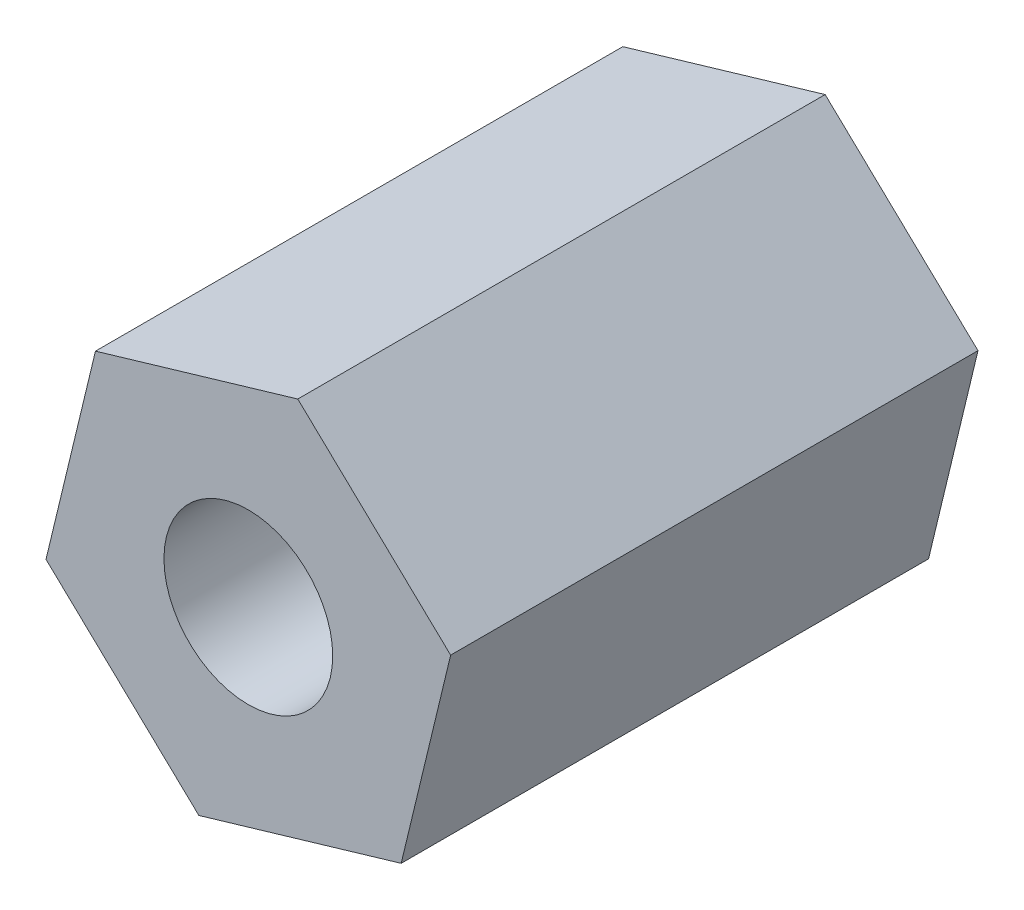
ISO-10303-21;
HEADER;
FILE_DESCRIPTION(('STEP AP214'),'2;1');
FILE_NAME('part.step','',(''),(''),'','','');
FILE_SCHEMA(('AUTOMOTIVE_DESIGN { 1 0 10303 214 1 1 1 1 }'));
ENDSEC;
DATA;
#1=APPLICATION_CONTEXT('core data for automotive mechanical design processes');
#2=APPLICATION_PROTOCOL_DEFINITION('international standard','automotive_design',2000,#1);
#3=PRODUCT_CONTEXT('',#1,'mechanical');
#4=PRODUCT('Part','Part','',(#3));
#5=PRODUCT_RELATED_PRODUCT_CATEGORY('part','',(#4));
#6=PRODUCT_DEFINITION_FORMATION('','',#4);
#7=PRODUCT_DEFINITION_CONTEXT('part definition',#1,'design');
#8=PRODUCT_DEFINITION('design','',#6,#7);
#9=PRODUCT_DEFINITION_SHAPE('','',#8);
#10=(LENGTH_UNIT() NAMED_UNIT(*) SI_UNIT(.MILLI.,.METRE.));
#11=(NAMED_UNIT(*) PLANE_ANGLE_UNIT() SI_UNIT($,.RADIAN.));
#12=(NAMED_UNIT(*) SI_UNIT($,.STERADIAN.) SOLID_ANGLE_UNIT());
#13=UNCERTAINTY_MEASURE_WITH_UNIT(LENGTH_MEASURE(1.E-05),#10,'distance_accuracy_value','');
#14=(GEOMETRIC_REPRESENTATION_CONTEXT(3) GLOBAL_UNCERTAINTY_ASSIGNED_CONTEXT((#13)) GLOBAL_UNIT_ASSIGNED_CONTEXT((#10,
#11,#12)) REPRESENTATION_CONTEXT('',''));
#15=CARTESIAN_POINT('',(0.,0.,0.));
#16=DIRECTION('',(0.,0.,1.));
#17=DIRECTION('',(1.,0.,0.));
#18=AXIS2_PLACEMENT_3D('',#15,#16,#17);
#19=CARTESIAN_POINT('',(-0.938021007151593,-3.88845941089042,10.));
#20=DIRECTION('',(-0.282969920992117,0.959128783747894,0.));
#21=DIRECTION('',(-0.959128783747894,-0.282969920992117,0.));
#22=AXIS2_PLACEMENT_3D('',#19,#20,#21);
#23=PLANE('',#22);
#24=DIRECTION('',(0.959128783747894,0.282969920992117,0.));
#25=VECTOR('',#24,1.);
#26=CARTESIAN_POINT('',(-0.938021007151593,-3.88845941089042,0.));
#27=LINE('',#26,#25);
#28=CARTESIAN_POINT('',(-0.938021007151593,-3.88845941089042,0.));
#29=VERTEX_POINT('',#28);
#30=CARTESIAN_POINT('',(2.89849412783998,-2.75657972692196,0.));
#31=VERTEX_POINT('',#30);
#32=EDGE_CURVE('E118',#29,#31,#27,.T.);
#33=ORIENTED_EDGE('',*,*,#32,.T.);
#34=DIRECTION('',(0.,0.,-1.));
#35=VECTOR('',#34,1.);
#36=CARTESIAN_POINT('',(2.89849412783998,-2.75657972692196,10.));
#37=LINE('',#36,#35);
#38=CARTESIAN_POINT('',(2.89849412783998,-2.75657972692196,10.));
#39=VERTEX_POINT('',#38);
#40=EDGE_CURVE('E11',#39,#31,#37,.T.);
#41=ORIENTED_EDGE('',*,*,#40,.F.);
#42=DIRECTION('',(0.959128783747894,0.282969920992117,0.));
#43=VECTOR('',#42,1.);
#44=CARTESIAN_POINT('',(-0.938021007151593,-3.88845941089042,10.));
#45=LINE('',#44,#43);
#46=CARTESIAN_POINT('',(-0.938021007151593,-3.88845941089042,10.));
#47=VERTEX_POINT('',#46);
#48=EDGE_CURVE('E129',#47,#39,#45,.T.);
#49=ORIENTED_EDGE('',*,*,#48,.F.);
#50=DIRECTION('',(0.,0.,-1.));
#51=VECTOR('',#50,1.);
#52=CARTESIAN_POINT('',(-0.938021007151593,-3.88845941089042,10.));
#53=LINE('',#52,#51);
#54=EDGE_CURVE('E114',#47,#29,#53,.T.);
#55=ORIENTED_EDGE('',*,*,#54,.T.);
#56=EDGE_LOOP('',(#33,#41,#49,#55));
#57=FACE_BOUND('',#56,.T.);
#58=ADVANCED_FACE('F34',(#57),#23,.F.);
#59=CARTESIAN_POINT('',(2.89849412783998,-2.75657972692196,10.));
#60=DIRECTION('',(-0.972114852722606,0.234505251787899,0.));
#61=DIRECTION('',(-0.234505251787899,-0.972114852722606,0.));
#62=AXIS2_PLACEMENT_3D('',#59,#60,#61);
#63=PLANE('',#62);
#64=DIRECTION('',(0.234505251787899,0.972114852722606,0.));
#65=VECTOR('',#64,1.);
#66=CARTESIAN_POINT('',(2.89849412783998,-2.75657972692196,0.));
#67=LINE('',#66,#65);
#68=CARTESIAN_POINT('',(3.83651513499158,1.13187968396847,0.));
#69=VERTEX_POINT('',#68);
#70=EDGE_CURVE('E121',#31,#69,#67,.T.);
#71=ORIENTED_EDGE('',*,*,#70,.T.);
#72=DIRECTION('',(0.,0.,-1.));
#73=VECTOR('',#72,1.);
#74=CARTESIAN_POINT('',(3.83651513499158,1.13187968396847,10.));
#75=LINE('',#74,#73);
#76=CARTESIAN_POINT('',(3.83651513499158,1.13187968396847,10.));
#77=VERTEX_POINT('',#76);
#78=EDGE_CURVE('E42',#77,#69,#75,.T.);
#79=ORIENTED_EDGE('',*,*,#78,.F.);
#80=DIRECTION('',(0.234505251787899,0.972114852722606,0.));
#81=VECTOR('',#80,1.);
#82=CARTESIAN_POINT('',(2.89849412783998,-2.75657972692196,10.));
#83=LINE('',#82,#81);
#84=EDGE_CURVE('E87',#39,#77,#83,.T.);
#85=ORIENTED_EDGE('',*,*,#84,.F.);
#86=ORIENTED_EDGE('',*,*,#40,.T.);
#87=EDGE_LOOP('',(#71,#79,#85,#86));
#88=FACE_BOUND('',#87,.T.);
#89=ADVANCED_FACE('F154',(#88),#63,.F.);
#90=CARTESIAN_POINT('',(3.83651513499158,1.13187968396847,10.));
#91=DIRECTION('',(-0.68914493173049,-0.724623531959996,0.));
#92=DIRECTION('',(0.724623531959996,-0.68914493173049,0.));
#93=AXIS2_PLACEMENT_3D('',#90,#91,#92);
#94=PLANE('',#93);
#95=DIRECTION('',(-0.724623531959996,0.68914493173049,0.));
#96=VECTOR('',#95,1.);
#97=CARTESIAN_POINT('',(3.83651513499158,1.13187968396847,0.));
#98=LINE('',#97,#96);
#99=CARTESIAN_POINT('',(0.938021007151594,3.88845941089042,0.));
#100=VERTEX_POINT('',#99);
#101=EDGE_CURVE('E124',#69,#100,#98,.T.);
#102=ORIENTED_EDGE('',*,*,#101,.T.);
#103=DIRECTION('',(0.,0.,-1.));
#104=VECTOR('',#103,1.);
#105=CARTESIAN_POINT('',(0.938021007151594,3.88845941089042,10.));
#106=LINE('',#105,#104);
#107=CARTESIAN_POINT('',(0.938021007151594,3.88845941089042,10.));
#108=VERTEX_POINT('',#107);
#109=EDGE_CURVE('E109',#108,#100,#106,.T.);
#110=ORIENTED_EDGE('',*,*,#109,.F.);
#111=DIRECTION('',(-0.724623531959996,0.68914493173049,0.));
#112=VECTOR('',#111,1.);
#113=CARTESIAN_POINT('',(3.83651513499158,1.13187968396847,10.));
#114=LINE('',#113,#112);
#115=EDGE_CURVE('E100',#77,#108,#114,.T.);
#116=ORIENTED_EDGE('',*,*,#115,.F.);
#117=ORIENTED_EDGE('',*,*,#78,.T.);
#118=EDGE_LOOP('',(#102,#110,#116,#117));
#119=FACE_BOUND('',#118,.T.);
#120=ADVANCED_FACE('F135',(#119),#94,.F.);
#121=CARTESIAN_POINT('',(0.938021007151594,3.88845941089042,10.));
#122=DIRECTION('',(0.282969920992117,-0.959128783747894,0.));
#123=DIRECTION('',(0.959128783747894,0.282969920992117,0.));
#124=AXIS2_PLACEMENT_3D('',#121,#122,#123);
#125=PLANE('',#124);
#126=DIRECTION('',(-0.959128783747895,-0.282969920992117,0.));
#127=VECTOR('',#126,1.);
#128=CARTESIAN_POINT('',(0.938021007151594,3.88845941089042,0.));
#129=LINE('',#128,#127);
#130=CARTESIAN_POINT('',(-2.89849412783998,2.75657972692196,0.));
#131=VERTEX_POINT('',#130);
#132=EDGE_CURVE('E108',#100,#131,#129,.T.);
#133=ORIENTED_EDGE('',*,*,#132,.T.);
#134=DIRECTION('',(0.,0.,-1.));
#135=VECTOR('',#134,1.);
#136=CARTESIAN_POINT('',(-2.89849412783998,2.75657972692196,10.));
#137=LINE('',#136,#135);
#138=CARTESIAN_POINT('',(-2.89849412783998,2.75657972692196,10.));
#139=VERTEX_POINT('',#138);
#140=EDGE_CURVE('E105',#139,#131,#137,.T.);
#141=ORIENTED_EDGE('',*,*,#140,.F.);
#142=DIRECTION('',(-0.959128783747895,-0.282969920992117,0.));
#143=VECTOR('',#142,1.);
#144=CARTESIAN_POINT('',(0.938021007151594,3.88845941089042,10.));
#145=LINE('',#144,#143);
#146=EDGE_CURVE('E94',#108,#139,#145,.T.);
#147=ORIENTED_EDGE('',*,*,#146,.F.);
#148=ORIENTED_EDGE('',*,*,#109,.T.);
#149=EDGE_LOOP('',(#133,#141,#147,#148));
#150=FACE_BOUND('',#149,.T.);
#151=ADVANCED_FACE('F106',(#150),#125,.F.);
#152=CARTESIAN_POINT('',(-2.89849412783998,2.75657972692196,10.));
#153=DIRECTION('',(0.972114852722606,-0.234505251787898,0.));
#154=DIRECTION('',(0.234505251787898,0.972114852722606,0.));
#155=AXIS2_PLACEMENT_3D('',#152,#153,#154);
#156=PLANE('',#155);
#157=DIRECTION('',(-0.234505251787898,-0.972114852722606,0.));
#158=VECTOR('',#157,1.);
#159=CARTESIAN_POINT('',(-2.89849412783998,2.75657972692196,0.));
#160=LINE('',#159,#158);
#161=CARTESIAN_POINT('',(-3.83651513499157,-1.13187968396847,0.));
#162=VERTEX_POINT('',#161);
#163=EDGE_CURVE('E73',#131,#162,#160,.T.);
#164=ORIENTED_EDGE('',*,*,#163,.T.);
#165=DIRECTION('',(0.,0.,-1.));
#166=VECTOR('',#165,1.);
#167=CARTESIAN_POINT('',(-3.83651513499157,-1.13187968396847,10.));
#168=LINE('',#167,#166);
#169=CARTESIAN_POINT('',(-3.83651513499157,-1.13187968396847,10.));
#170=VERTEX_POINT('',#169);
#171=EDGE_CURVE('E110',#170,#162,#168,.T.);
#172=ORIENTED_EDGE('',*,*,#171,.F.);
#173=DIRECTION('',(-0.234505251787898,-0.972114852722606,0.));
#174=VECTOR('',#173,1.);
#175=CARTESIAN_POINT('',(-2.89849412783998,2.75657972692196,10.));
#176=LINE('',#175,#174);
#177=EDGE_CURVE('E98',#139,#170,#176,.T.);
#178=ORIENTED_EDGE('',*,*,#177,.F.);
#179=ORIENTED_EDGE('',*,*,#140,.T.);
#180=EDGE_LOOP('',(#164,#172,#178,#179));
#181=FACE_BOUND('',#180,.T.);
#182=ADVANCED_FACE('F112',(#181),#156,.F.);
#183=CARTESIAN_POINT('',(-3.83651513499157,-1.13187968396847,10.));
#184=DIRECTION('',(0.68914493173049,0.724623531959996,0.));
#185=DIRECTION('',(-0.724623531959996,0.68914493173049,0.));
#186=AXIS2_PLACEMENT_3D('',#183,#184,#185);
#187=PLANE('',#186);
#188=DIRECTION('',(0.724623531959996,-0.68914493173049,0.));
#189=VECTOR('',#188,1.);
#190=CARTESIAN_POINT('',(-3.83651513499157,-1.13187968396847,0.));
#191=LINE('',#190,#189);
#192=EDGE_CURVE('E79',#162,#29,#191,.T.);
#193=ORIENTED_EDGE('',*,*,#192,.T.);
#194=ORIENTED_EDGE('',*,*,#54,.F.);
#195=DIRECTION('',(0.724623531959996,-0.68914493173049,0.));
#196=VECTOR('',#195,1.);
#197=CARTESIAN_POINT('',(-3.83651513499157,-1.13187968396847,10.));
#198=LINE('',#197,#196);
#199=EDGE_CURVE('E50',#170,#47,#198,.T.);
#200=ORIENTED_EDGE('',*,*,#199,.F.);
#201=ORIENTED_EDGE('',*,*,#171,.T.);
#202=EDGE_LOOP('',(#193,#194,#200,#201));
#203=FACE_BOUND('',#202,.T.);
#204=ADVANCED_FACE('F142',(#203),#187,.F.);
#205=CARTESIAN_POINT('',(0.,0.,10.));
#206=DIRECTION('',(0.,0.,1.));
#207=DIRECTION('',(1.,0.,0.));
#208=AXIS2_PLACEMENT_3D('',#205,#206,#207);
#209=PLANE('',#208);
#210=CARTESIAN_POINT('',(0.,0.,10.));
#211=DIRECTION('',(0.,0.,1.));
#212=DIRECTION('',(1.,0.,0.));
#213=AXIS2_PLACEMENT_3D('',#210,#211,#212);
#214=CIRCLE('',#213,1.6);
#215=CARTESIAN_POINT('',(1.6,0.,10.));
#216=VERTEX_POINT('',#215);
#217=EDGE_CURVE('E122',#216,#216,#214,.F.);
#218=ORIENTED_EDGE('',*,*,#217,.T.);
#219=EDGE_LOOP('',(#218));
#220=FACE_BOUND('',#219,.T.);
#221=ORIENTED_EDGE('',*,*,#48,.T.);
#222=ORIENTED_EDGE('',*,*,#84,.T.);
#223=ORIENTED_EDGE('',*,*,#115,.T.);
#224=ORIENTED_EDGE('',*,*,#146,.T.);
#225=ORIENTED_EDGE('',*,*,#177,.T.);
#226=ORIENTED_EDGE('',*,*,#199,.T.);
#227=EDGE_LOOP('',(#221,#222,#223,#224,#225,#226));
#228=FACE_BOUND('',#227,.T.);
#229=ADVANCED_FACE('F96',(#220,#228),#209,.T.);
#230=CARTESIAN_POINT('',(0.,0.,0.));
#231=DIRECTION('',(0.,0.,1.));
#232=DIRECTION('',(1.,0.,0.));
#233=AXIS2_PLACEMENT_3D('',#230,#231,#232);
#234=PLANE('',#233);
#235=CARTESIAN_POINT('',(0.,0.,0.));
#236=DIRECTION('',(0.,0.,1.));
#237=DIRECTION('',(1.,0.,0.));
#238=AXIS2_PLACEMENT_3D('',#235,#236,#237);
#239=CIRCLE('',#238,1.6);
#240=CARTESIAN_POINT('',(1.6,0.,0.));
#241=VERTEX_POINT('',#240);
#242=EDGE_CURVE('E209',#241,#241,#239,.T.);
#243=ORIENTED_EDGE('',*,*,#242,.T.);
#244=EDGE_LOOP('',(#243));
#245=FACE_BOUND('',#244,.T.);
#246=ORIENTED_EDGE('',*,*,#32,.F.);
#247=ORIENTED_EDGE('',*,*,#192,.F.);
#248=ORIENTED_EDGE('',*,*,#163,.F.);
#249=ORIENTED_EDGE('',*,*,#132,.F.);
#250=ORIENTED_EDGE('',*,*,#101,.F.);
#251=ORIENTED_EDGE('',*,*,#70,.F.);
#252=EDGE_LOOP('',(#246,#247,#248,#249,#250,#251));
#253=FACE_BOUND('',#252,.T.);
#254=ADVANCED_FACE('F138',(#245,#253),#234,.F.);
#255=CARTESIAN_POINT('',(0.,0.,48.));
#256=DIRECTION('',(0.,0.,-1.));
#257=DIRECTION('',(-1.,0.,0.));
#258=AXIS2_PLACEMENT_3D('',#255,#256,#257);
#259=CYLINDRICAL_SURFACE('',#258,1.6);
#260=ORIENTED_EDGE('',*,*,#217,.F.);
#261=EDGE_LOOP('',(#260));
#262=FACE_BOUND('',#261,.T.);
#263=ORIENTED_EDGE('',*,*,#242,.F.);
#264=EDGE_LOOP('',(#263));
#265=FACE_BOUND('',#264,.T.);
#266=ADVANCED_FACE('F191',(#262,#265),#259,.F.);
#267=CLOSED_SHELL('',(#58,#89,#120,#151,#182,#204,#229,#254,#266));
#268=MANIFOLD_SOLID_BREP('B2',#267);
#269=ADVANCED_BREP_SHAPE_REPRESENTATION('',(#18,#268),#14);
#270=SHAPE_DEFINITION_REPRESENTATION(#9,#269);
ENDSEC;
END-ISO-10303-21;
